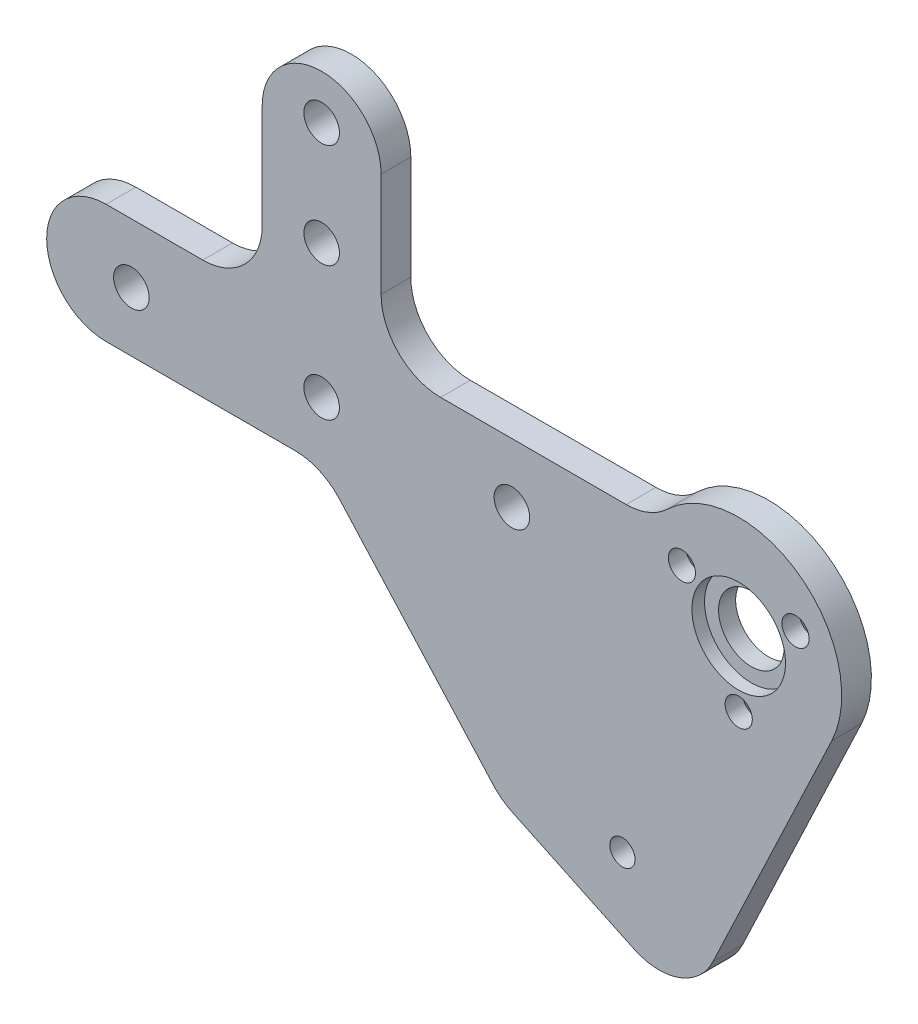
ISO-10303-21;
HEADER;
FILE_DESCRIPTION(('STEP AP214'),'2;1');
FILE_NAME('part.step','',(''),(''),'','','');
FILE_SCHEMA(('AUTOMOTIVE_DESIGN { 1 0 10303 214 1 1 1 1 }'));
ENDSEC;
DATA;
#1=APPLICATION_CONTEXT('core data for automotive mechanical design processes');
#2=APPLICATION_PROTOCOL_DEFINITION('international standard','automotive_design',2000,#1);
#3=PRODUCT_CONTEXT('',#1,'mechanical');
#4=PRODUCT('Part','Part','',(#3));
#5=PRODUCT_RELATED_PRODUCT_CATEGORY('part','',(#4));
#6=PRODUCT_DEFINITION_FORMATION('','',#4);
#7=PRODUCT_DEFINITION_CONTEXT('part definition',#1,'design');
#8=PRODUCT_DEFINITION('design','',#6,#7);
#9=PRODUCT_DEFINITION_SHAPE('','',#8);
#10=(LENGTH_UNIT() NAMED_UNIT(*) SI_UNIT(.MILLI.,.METRE.));
#11=(NAMED_UNIT(*) PLANE_ANGLE_UNIT() SI_UNIT($,.RADIAN.));
#12=(NAMED_UNIT(*) SI_UNIT($,.STERADIAN.) SOLID_ANGLE_UNIT());
#13=UNCERTAINTY_MEASURE_WITH_UNIT(LENGTH_MEASURE(1.E-05),#10,'distance_accuracy_value','');
#14=(GEOMETRIC_REPRESENTATION_CONTEXT(3) GLOBAL_UNCERTAINTY_ASSIGNED_CONTEXT((#13)) GLOBAL_UNIT_ASSIGNED_CONTEXT((#10,
#11,#12)) REPRESENTATION_CONTEXT('',''));
#15=CARTESIAN_POINT('',(0.,0.,0.));
#16=DIRECTION('',(0.,0.,1.));
#17=DIRECTION('',(1.,0.,0.));
#18=AXIS2_PLACEMENT_3D('',#15,#16,#17);
#19=CARTESIAN_POINT('',(0.,0.,0.));
#20=DIRECTION('',(0.,0.,1.));
#21=DIRECTION('',(1.,0.,0.));
#22=AXIS2_PLACEMENT_3D('',#19,#20,#21);
#23=PLANE('',#22);
#24=CARTESIAN_POINT('',(0.,119.190279828564,0.));
#25=DIRECTION('',(0.,0.,-1.));
#26=DIRECTION('',(-1.,0.,0.));
#27=AXIS2_PLACEMENT_3D('',#24,#25,#26);
#28=CIRCLE('',#27,1.89864999999999);
#29=CARTESIAN_POINT('',(-1.89864999999999,119.190279828564,0.));
#30=VERTEX_POINT('',#29);
#31=EDGE_CURVE('E410',#30,#30,#28,.T.);
#32=ORIENTED_EDGE('',*,*,#31,.F.);
#33=EDGE_LOOP('',(#32));
#34=FACE_BOUND('',#33,.T.);
#35=DIRECTION('',(1.,0.,0.));
#36=VECTOR('',#35,1.);
#37=CARTESIAN_POINT('',(0.,87.4402798285638,0.));
#38=LINE('',#37,#36);
#39=CARTESIAN_POINT('',(-23.01875,87.4402798285638,0.));
#40=VERTEX_POINT('',#39);
#41=CARTESIAN_POINT('',(-2.82498094697723,87.4402798285638,0.));
#42=VERTEX_POINT('',#41);
#43=EDGE_CURVE('E224',#40,#42,#38,.T.);
#44=ORIENTED_EDGE('',*,*,#43,.F.);
#45=CARTESIAN_POINT('',(-23.01875,93.7902798285638,0.));
#46=DIRECTION('',(0.,0.,1.));
#47=DIRECTION('',(1.,0.,0.));
#48=AXIS2_PLACEMENT_3D('',#45,#46,#47);
#49=CIRCLE('',#48,6.35);
#50=CARTESIAN_POINT('',(-29.36875,93.7902798285633,0.));
#51=VERTEX_POINT('',#50);
#52=EDGE_CURVE('E267',#40,#51,#49,.F.);
#53=ORIENTED_EDGE('',*,*,#52,.T.);
#54=CARTESIAN_POINT('',(-23.01875,93.7902798285633,0.));
#55=DIRECTION('',(0.,0.,1.));
#56=DIRECTION('',(1.,0.,0.));
#57=AXIS2_PLACEMENT_3D('',#54,#55,#56);
#58=CIRCLE('',#57,6.35);
#59=CARTESIAN_POINT('',(-23.0187500000001,100.140279828563,0.));
#60=VERTEX_POINT('',#59);
#61=EDGE_CURVE('E265',#51,#60,#58,.F.);
#62=ORIENTED_EDGE('',*,*,#61,.T.);
#63=DIRECTION('',(1.,0.,0.));
#64=VECTOR('',#63,1.);
#65=CARTESIAN_POINT('',(-9.16851453191598E-13,100.140279828563,0.));
#66=LINE('',#65,#64);
#67=CARTESIAN_POINT('',(-12.6999999999999,100.140279828563,0.));
#68=VERTEX_POINT('',#67);
#69=EDGE_CURVE('E221',#60,#68,#66,.T.);
#70=ORIENTED_EDGE('',*,*,#69,.T.);
#71=CARTESIAN_POINT('',(-12.7,106.490279828563,0.));
#72=DIRECTION('',(0.,0.,1.));
#73=DIRECTION('',(1.,0.,0.));
#74=AXIS2_PLACEMENT_3D('',#71,#72,#73);
#75=CIRCLE('',#74,6.35);
#76=CARTESIAN_POINT('',(-6.35,106.490279828563,0.));
#77=VERTEX_POINT('',#76);
#78=EDGE_CURVE('E300',#68,#77,#75,.T.);
#79=ORIENTED_EDGE('',*,*,#78,.T.);
#80=DIRECTION('',(0.,-1.,0.));
#81=VECTOR('',#80,1.);
#82=CARTESIAN_POINT('',(-6.34999999999998,0.,0.));
#83=LINE('',#82,#81);
#84=CARTESIAN_POINT('',(-6.35,117.602779828564,0.));
#85=VERTEX_POINT('',#84);
#86=EDGE_CURVE('E225',#85,#77,#83,.T.);
#87=ORIENTED_EDGE('',*,*,#86,.F.);
#88=CARTESIAN_POINT('',(0.,117.602779828564,0.));
#89=DIRECTION('',(0.,0.,1.));
#90=DIRECTION('',(1.,0.,0.));
#91=AXIS2_PLACEMENT_3D('',#88,#89,#90);
#92=CIRCLE('',#91,6.35);
#93=CARTESIAN_POINT('',(6.35,117.602779828564,0.));
#94=VERTEX_POINT('',#93);
#95=EDGE_CURVE('E229',#94,#85,#92,.T.);
#96=ORIENTED_EDGE('',*,*,#95,.F.);
#97=DIRECTION('',(0.,-1.,0.));
#98=VECTOR('',#97,1.);
#99=CARTESIAN_POINT('',(6.35000000000002,0.,0.));
#100=LINE('',#99,#98);
#101=CARTESIAN_POINT('',(6.35,106.490279828564,0.));
#102=VERTEX_POINT('',#101);
#103=EDGE_CURVE('E226',#94,#102,#100,.T.);
#104=ORIENTED_EDGE('',*,*,#103,.T.);
#105=CARTESIAN_POINT('',(12.7,106.490279828564,0.));
#106=DIRECTION('',(0.,0.,1.));
#107=DIRECTION('',(1.,0.,0.));
#108=AXIS2_PLACEMENT_3D('',#105,#106,#107);
#109=CIRCLE('',#108,6.35);
#110=CARTESIAN_POINT('',(12.7000000000001,100.140279828564,0.));
#111=VERTEX_POINT('',#110);
#112=EDGE_CURVE('E45',#102,#111,#109,.T.);
#113=ORIENTED_EDGE('',*,*,#112,.T.);
#114=CARTESIAN_POINT('',(32.5242913171157,100.140279828564,0.));
#115=VERTEX_POINT('',#114);
#116=EDGE_CURVE('E220',#111,#115,#66,.T.);
#117=ORIENTED_EDGE('',*,*,#116,.T.);
#118=CARTESIAN_POINT('',(32.5242913171156,106.490279828564,0.));
#119=DIRECTION('',(0.,0.,1.));
#120=DIRECTION('',(1.,0.,0.));
#121=AXIS2_PLACEMENT_3D('',#118,#119,#120);
#122=CIRCLE('',#121,6.35);
#123=CARTESIAN_POINT('',(36.9233094126202,101.910854122711,0.));
#124=VERTEX_POINT('',#123);
#125=EDGE_CURVE('E292',#115,#124,#122,.T.);
#126=ORIENTED_EDGE('',*,*,#125,.T.);
#127=CARTESIAN_POINT('',(44.5436557197935,93.9779906952501,0.));
#128=DIRECTION('',(0.,0.,1.));
#129=DIRECTION('',(1.,0.,0.));
#130=AXIS2_PLACEMENT_3D('',#127,#128,#129);
#131=CIRCLE('',#130,11.);
#132=CARTESIAN_POINT('',(54.483635504868,89.2666424941181,0.));
#133=VERTEX_POINT('',#132);
#134=EDGE_CURVE('E218',#133,#124,#131,.T.);
#135=ORIENTED_EDGE('',*,*,#134,.F.);
#136=DIRECTION('',(-0.428304381921091,-0.903634525915866,0.));
#137=VECTOR('',#136,1.);
#138=CARTESIAN_POINT('',(9.93997978507457,-4.71134820113202,0.));
#139=LINE('',#138,#137);
#140=CARTESIAN_POINT('',(41.7844105809077,62.4738788007127,0.));
#141=VERTEX_POINT('',#140);
#142=EDGE_CURVE('E170',#133,#141,#139,.T.);
#143=ORIENTED_EDGE('',*,*,#142,.T.);
#144=CARTESIAN_POINT('',(36.0463313413419,65.1936116259116,0.));
#145=DIRECTION('',(0.,0.,1.));
#146=DIRECTION('',(1.,0.,0.));
#147=AXIS2_PLACEMENT_3D('',#144,#145,#146);
#148=CIRCLE('',#147,6.35);
#149=CARTESIAN_POINT('',(33.326598516143,59.4555323863458,0.));
#150=VERTEX_POINT('',#149);
#151=EDGE_CURVE('E263',#141,#150,#148,.F.);
#152=ORIENTED_EDGE('',*,*,#151,.T.);
#153=DIRECTION('',(-0.903634525915866,0.42830438192109,0.));
#154=VECTOR('',#153,1.);
#155=CARTESIAN_POINT('',(29.1246979706341,61.4471477622789,0.));
#156=LINE('',#155,#154);
#157=CARTESIAN_POINT('',(20.3316402914357,65.6148782179833,0.));
#158=VERTEX_POINT('',#157);
#159=EDGE_CURVE('E213',#150,#158,#156,.T.);
#160=ORIENTED_EDGE('',*,*,#159,.T.);
#161=CARTESIAN_POINT('',(23.0513731166347,71.3529574575491,0.));
#162=DIRECTION('',(0.,0.,1.));
#163=DIRECTION('',(1.,0.,0.));
#164=AXIS2_PLACEMENT_3D('',#161,#162,#163);
#165=CIRCLE('',#164,6.35);
#166=CARTESIAN_POINT('',(18.3348853905262,67.1012232784795,0.));
#167=VERTEX_POINT('',#166);
#168=EDGE_CURVE('E261',#158,#167,#165,.F.);
#169=ORIENTED_EDGE('',*,*,#168,.T.);
#170=DIRECTION('',(-0.66956443764875,0.742753972615504,0.));
#171=VECTOR('',#170,1.);
#172=CARTESIAN_POINT('',(43.4859438897894,39.2009233739427,0.));
#173=LINE('',#172,#171);
#174=CARTESIAN_POINT('',(1.89150677913122,85.3420140076334,0.));
#175=VERTEX_POINT('',#174);
#176=EDGE_CURVE('E210',#167,#175,#173,.T.);
#177=ORIENTED_EDGE('',*,*,#176,.T.);
#178=CARTESIAN_POINT('',(-2.82498094697723,81.0902798285638,0.));
#179=DIRECTION('',(0.,0.,1.));
#180=DIRECTION('',(1.,0.,0.));
#181=AXIS2_PLACEMENT_3D('',#178,#179,#180);
#182=CIRCLE('',#181,6.35);
#183=EDGE_CURVE('E296',#175,#42,#182,.T.);
#184=ORIENTED_EDGE('',*,*,#183,.T.);
#185=EDGE_LOOP('',(#44,#53,#62,#70,#79,#87,#96,#104,#113,#117,#126,#135,#143,#152,#160,#169,
#177,#184));
#186=FACE_BOUND('',#185,.T.);
#187=CARTESIAN_POINT('',(44.5436557197935,93.9779906952501,0.));
#188=DIRECTION('',(0.,0.,1.));
#189=DIRECTION('',(1.,0.,0.));
#190=AXIS2_PLACEMENT_3D('',#187,#188,#189);
#191=CIRCLE('',#190,3.5);
#192=CARTESIAN_POINT('',(48.0436557197935,93.9779906952501,0.));
#193=VERTEX_POINT('',#192);
#194=EDGE_CURVE('E235',#193,#193,#191,.T.);
#195=ORIENTED_EDGE('',*,*,#194,.T.);
#196=EDGE_LOOP('',(#195));
#197=FACE_BOUND('',#196,.T.);
#198=CARTESIAN_POINT('',(0.,108.077779828564,0.));
#199=DIRECTION('',(0.,0.,-1.));
#200=DIRECTION('',(-1.,0.,0.));
#201=AXIS2_PLACEMENT_3D('',#198,#199,#200);
#202=CIRCLE('',#201,1.89864999999999);
#203=CARTESIAN_POINT('',(-1.89864999999999,108.077779828564,0.));
#204=VERTEX_POINT('',#203);
#205=EDGE_CURVE('E404',#204,#204,#202,.T.);
#206=ORIENTED_EDGE('',*,*,#205,.F.);
#207=EDGE_LOOP('',(#206));
#208=FACE_BOUND('',#207,.T.);
#209=CARTESIAN_POINT('',(38.4814778933024,97.4779906952501,0.));
#210=DIRECTION('',(0.,0.,-1.));
#211=DIRECTION('',(-1.,0.,0.));
#212=AXIS2_PLACEMENT_3D('',#209,#210,#211);
#213=CIRCLE('',#212,2.75);
#214=CARTESIAN_POINT('',(35.7314778933024,97.4779906952501,0.));
#215=VERTEX_POINT('',#214);
#216=EDGE_CURVE('E395',#215,#215,#213,.T.);
#217=ORIENTED_EDGE('',*,*,#216,.F.);
#218=EDGE_LOOP('',(#217));
#219=FACE_BOUND('',#218,.T.);
#220=CARTESIAN_POINT('',(44.5436557197935,86.9779906952501,0.));
#221=DIRECTION('',(0.,0.,-1.));
#222=DIRECTION('',(-1.,0.,0.));
#223=AXIS2_PLACEMENT_3D('',#220,#221,#222);
#224=CIRCLE('',#223,2.75);
#225=CARTESIAN_POINT('',(41.7936557197935,86.9779906952501,0.));
#226=VERTEX_POINT('',#225);
#227=EDGE_CURVE('E386',#226,#226,#224,.T.);
#228=ORIENTED_EDGE('',*,*,#227,.F.);
#229=EDGE_LOOP('',(#228));
#230=FACE_BOUND('',#229,.T.);
#231=CARTESIAN_POINT('',(50.6058335462846,97.4779906952501,0.));
#232=DIRECTION('',(0.,0.,-1.));
#233=DIRECTION('',(-1.,0.,0.));
#234=AXIS2_PLACEMENT_3D('',#231,#232,#233);
#235=CIRCLE('',#234,2.75);
#236=CARTESIAN_POINT('',(47.8558335462846,97.4779906952501,0.));
#237=VERTEX_POINT('',#236);
#238=EDGE_CURVE('E244',#237,#237,#235,.T.);
#239=ORIENTED_EDGE('',*,*,#238,.F.);
#240=EDGE_LOOP('',(#239));
#241=FACE_BOUND('',#240,.T.);
#242=CARTESIAN_POINT('',(20.32,93.7902798285639,0.));
#243=DIRECTION('',(0.,0.,-1.));
#244=DIRECTION('',(-1.,0.,0.));
#245=AXIS2_PLACEMENT_3D('',#242,#243,#244);
#246=CIRCLE('',#245,1.89865);
#247=CARTESIAN_POINT('',(18.42135,93.7902798285639,0.));
#248=VERTEX_POINT('',#247);
#249=EDGE_CURVE('E245',#248,#248,#246,.T.);
#250=ORIENTED_EDGE('',*,*,#249,.F.);
#251=EDGE_LOOP('',(#250));
#252=FACE_BOUND('',#251,.T.);
#253=CARTESIAN_POINT('',(0.,93.7902798285639,0.));
#254=DIRECTION('',(0.,0.,-1.));
#255=DIRECTION('',(-1.,0.,0.));
#256=AXIS2_PLACEMENT_3D('',#253,#254,#255);
#257=CIRCLE('',#256,1.89865);
#258=CARTESIAN_POINT('',(-1.89865,93.7902798285639,0.));
#259=VERTEX_POINT('',#258);
#260=EDGE_CURVE('E370',#259,#259,#257,.T.);
#261=ORIENTED_EDGE('',*,*,#260,.F.);
#262=EDGE_LOOP('',(#261));
#263=FACE_BOUND('',#262,.T.);
#264=CARTESIAN_POINT('',(-20.32,93.7902798285639,0.));
#265=DIRECTION('',(0.,0.,-1.));
#266=DIRECTION('',(-1.,0.,0.));
#267=AXIS2_PLACEMENT_3D('',#264,#265,#266);
#268=CIRCLE('',#267,1.89865);
#269=CARTESIAN_POINT('',(-22.21865,93.7902798285639,0.));
#270=VERTEX_POINT('',#269);
#271=EDGE_CURVE('E359',#270,#270,#268,.T.);
#272=ORIENTED_EDGE('',*,*,#271,.F.);
#273=EDGE_LOOP('',(#272));
#274=FACE_BOUND('',#273,.T.);
#275=CARTESIAN_POINT('',(32.1228286440819,67.7725894436899,0.));
#276=DIRECTION('',(0.,0.,-1.));
#277=DIRECTION('',(-1.,0.,0.));
#278=AXIS2_PLACEMENT_3D('',#275,#276,#277);
#279=CIRCLE('',#278,1.35254999999999);
#280=CARTESIAN_POINT('',(30.7702786440819,67.7725894436899,0.));
#281=VERTEX_POINT('',#280);
#282=EDGE_CURVE('E346',#281,#281,#279,.T.);
#283=ORIENTED_EDGE('',*,*,#282,.F.);
#284=EDGE_LOOP('',(#283));
#285=FACE_BOUND('',#284,.T.);
#286=ADVANCED_FACE('F36',(#34,#186,#197,#208,#219,#230,#241,#252,#263,#274,#285),#23,.F.);
#287=CARTESIAN_POINT('',(44.5436557197935,93.9779906952501,3.175));
#288=DIRECTION('',(0.,0.,-1.));
#289=DIRECTION('',(-1.,0.,0.));
#290=AXIS2_PLACEMENT_3D('',#287,#288,#289);
#291=CYLINDRICAL_SURFACE('',#290,3.5);
#292=ORIENTED_EDGE('',*,*,#194,.F.);
#293=EDGE_LOOP('',(#292));
#294=FACE_BOUND('',#293,.T.);
#295=CARTESIAN_POINT('',(44.5436557197935,93.9779906952501,1.82626));
#296=DIRECTION('',(0.,0.,1.));
#297=DIRECTION('',(1.,0.,0.));
#298=AXIS2_PLACEMENT_3D('',#295,#296,#297);
#299=CIRCLE('',#298,3.5);
#300=CARTESIAN_POINT('',(48.0436557197935,93.9779906952501,1.82626));
#301=VERTEX_POINT('',#300);
#302=EDGE_CURVE('E353',#301,#301,#299,.T.);
#303=ORIENTED_EDGE('',*,*,#302,.T.);
#304=EDGE_LOOP('',(#303));
#305=FACE_BOUND('',#304,.T.);
#306=ADVANCED_FACE('F443',(#294,#305),#291,.F.);
#307=CARTESIAN_POINT('',(0.,0.,3.175));
#308=DIRECTION('',(0.,0.,1.));
#309=DIRECTION('',(1.,0.,0.));
#310=AXIS2_PLACEMENT_3D('',#307,#308,#309);
#311=PLANE('',#310);
#312=CARTESIAN_POINT('',(32.1228286440819,67.7725894436899,3.175));
#313=DIRECTION('',(0.,0.,1.));
#314=DIRECTION('',(1.,0.,0.));
#315=AXIS2_PLACEMENT_3D('',#312,#313,#314);
#316=CIRCLE('',#315,1.35254999999997);
#317=CARTESIAN_POINT('',(33.4753786440818,67.7725894436899,3.175));
#318=VERTEX_POINT('',#317);
#319=EDGE_CURVE('E348',#318,#318,#316,.T.);
#320=ORIENTED_EDGE('',*,*,#319,.F.);
#321=EDGE_LOOP('',(#320));
#322=FACE_BOUND('',#321,.T.);
#323=CARTESIAN_POINT('',(-23.01875,93.7902798285633,3.175));
#324=DIRECTION('',(0.,0.,1.));
#325=DIRECTION('',(1.,0.,0.));
#326=AXIS2_PLACEMENT_3D('',#323,#324,#325);
#327=CIRCLE('',#326,6.35);
#328=CARTESIAN_POINT('',(-23.0187500000001,100.140279828563,3.175));
#329=VERTEX_POINT('',#328);
#330=CARTESIAN_POINT('',(-29.36875,93.7902798285633,3.175));
#331=VERTEX_POINT('',#330);
#332=EDGE_CURVE('E52',#329,#331,#327,.T.);
#333=ORIENTED_EDGE('',*,*,#332,.T.);
#334=CARTESIAN_POINT('',(-23.01875,93.7902798285638,3.175));
#335=DIRECTION('',(0.,0.,1.));
#336=DIRECTION('',(1.,0.,0.));
#337=AXIS2_PLACEMENT_3D('',#334,#335,#336);
#338=CIRCLE('',#337,6.35);
#339=CARTESIAN_POINT('',(-23.01875,87.4402798285638,3.175));
#340=VERTEX_POINT('',#339);
#341=EDGE_CURVE('E273',#331,#340,#338,.T.);
#342=ORIENTED_EDGE('',*,*,#341,.T.);
#343=DIRECTION('',(1.,0.,0.));
#344=VECTOR('',#343,1.);
#345=CARTESIAN_POINT('',(0.,87.4402798285638,3.175));
#346=LINE('',#345,#344);
#347=CARTESIAN_POINT('',(-2.82498094697723,87.4402798285638,3.175));
#348=VERTEX_POINT('',#347);
#349=EDGE_CURVE('E199',#340,#348,#346,.T.);
#350=ORIENTED_EDGE('',*,*,#349,.T.);
#351=CARTESIAN_POINT('',(-2.82498094697723,81.0902798285638,3.175));
#352=DIRECTION('',(0.,0.,1.));
#353=DIRECTION('',(1.,0.,0.));
#354=AXIS2_PLACEMENT_3D('',#351,#352,#353);
#355=CIRCLE('',#354,6.35);
#356=CARTESIAN_POINT('',(1.89150677913122,85.3420140076334,3.175));
#357=VERTEX_POINT('',#356);
#358=EDGE_CURVE('E298',#348,#357,#355,.F.);
#359=ORIENTED_EDGE('',*,*,#358,.T.);
#360=DIRECTION('',(-0.66956443764875,0.742753972615504,0.));
#361=VECTOR('',#360,1.);
#362=CARTESIAN_POINT('',(43.4859438897894,39.2009233739427,3.175));
#363=LINE('',#362,#361);
#364=CARTESIAN_POINT('',(18.3348853905262,67.1012232784795,3.175));
#365=VERTEX_POINT('',#364);
#366=EDGE_CURVE('E193',#365,#357,#363,.T.);
#367=ORIENTED_EDGE('',*,*,#366,.F.);
#368=CARTESIAN_POINT('',(23.0513731166347,71.3529574575491,3.175));
#369=DIRECTION('',(0.,0.,1.));
#370=DIRECTION('',(1.,0.,0.));
#371=AXIS2_PLACEMENT_3D('',#368,#369,#370);
#372=CIRCLE('',#371,6.35);
#373=CARTESIAN_POINT('',(20.3316402914357,65.6148782179833,3.175));
#374=VERTEX_POINT('',#373);
#375=EDGE_CURVE('E269',#365,#374,#372,.T.);
#376=ORIENTED_EDGE('',*,*,#375,.T.);
#377=DIRECTION('',(-0.903634525915866,0.42830438192109,0.));
#378=VECTOR('',#377,1.);
#379=CARTESIAN_POINT('',(29.1246979706341,61.4471477622789,3.175));
#380=LINE('',#379,#378);
#381=CARTESIAN_POINT('',(33.326598516143,59.4555323863458,3.175));
#382=VERTEX_POINT('',#381);
#383=EDGE_CURVE('E190',#382,#374,#380,.T.);
#384=ORIENTED_EDGE('',*,*,#383,.F.);
#385=CARTESIAN_POINT('',(36.0463313413419,65.1936116259116,3.175));
#386=DIRECTION('',(0.,0.,1.));
#387=DIRECTION('',(1.,0.,0.));
#388=AXIS2_PLACEMENT_3D('',#385,#386,#387);
#389=CIRCLE('',#388,6.35);
#390=CARTESIAN_POINT('',(41.7844105809077,62.4738788007127,3.175));
#391=VERTEX_POINT('',#390);
#392=EDGE_CURVE('E189',#382,#391,#389,.T.);
#393=ORIENTED_EDGE('',*,*,#392,.T.);
#394=DIRECTION('',(-0.428304381921091,-0.903634525915866,0.));
#395=VECTOR('',#394,1.);
#396=CARTESIAN_POINT('',(9.93997978507457,-4.71134820113202,3.175));
#397=LINE('',#396,#395);
#398=CARTESIAN_POINT('',(54.483635504868,89.2666424941181,3.175));
#399=VERTEX_POINT('',#398);
#400=EDGE_CURVE('E167',#399,#391,#397,.T.);
#401=ORIENTED_EDGE('',*,*,#400,.F.);
#402=CARTESIAN_POINT('',(44.5436557197935,93.9779906952501,3.175));
#403=DIRECTION('',(0.,0.,1.));
#404=DIRECTION('',(1.,0.,0.));
#405=AXIS2_PLACEMENT_3D('',#402,#403,#404);
#406=CIRCLE('',#405,11.);
#407=CARTESIAN_POINT('',(36.9233094126202,101.910854122711,3.175));
#408=VERTEX_POINT('',#407);
#409=EDGE_CURVE('E178',#399,#408,#406,.T.);
#410=ORIENTED_EDGE('',*,*,#409,.T.);
#411=CARTESIAN_POINT('',(32.5242913171156,106.490279828564,3.175));
#412=DIRECTION('',(0.,0.,1.));
#413=DIRECTION('',(1.,0.,0.));
#414=AXIS2_PLACEMENT_3D('',#411,#412,#413);
#415=CIRCLE('',#414,6.35);
#416=CARTESIAN_POINT('',(32.5242913171157,100.140279828564,3.175));
#417=VERTEX_POINT('',#416);
#418=EDGE_CURVE('E294',#408,#417,#415,.F.);
#419=ORIENTED_EDGE('',*,*,#418,.T.);
#420=DIRECTION('',(1.,0.,0.));
#421=VECTOR('',#420,1.);
#422=CARTESIAN_POINT('',(-9.16851453191598E-13,100.140279828563,3.175));
#423=LINE('',#422,#421);
#424=CARTESIAN_POINT('',(12.7000000000001,100.140279828564,3.175));
#425=VERTEX_POINT('',#424);
#426=EDGE_CURVE('E183',#425,#417,#423,.T.);
#427=ORIENTED_EDGE('',*,*,#426,.F.);
#428=CARTESIAN_POINT('',(12.7,106.490279828564,3.175));
#429=DIRECTION('',(0.,0.,1.));
#430=DIRECTION('',(1.,0.,0.));
#431=AXIS2_PLACEMENT_3D('',#428,#429,#430);
#432=CIRCLE('',#431,6.35);
#433=CARTESIAN_POINT('',(6.35,106.490279828564,3.175));
#434=VERTEX_POINT('',#433);
#435=EDGE_CURVE('E11',#425,#434,#432,.F.);
#436=ORIENTED_EDGE('',*,*,#435,.T.);
#437=DIRECTION('',(0.,-1.,0.));
#438=VECTOR('',#437,1.);
#439=CARTESIAN_POINT('',(6.35000000000002,0.,3.175));
#440=LINE('',#439,#438);
#441=CARTESIAN_POINT('',(6.35,117.602779828564,3.175));
#442=VERTEX_POINT('',#441);
#443=EDGE_CURVE('E201',#442,#434,#440,.T.);
#444=ORIENTED_EDGE('',*,*,#443,.F.);
#445=CARTESIAN_POINT('',(0.,117.602779828564,3.175));
#446=DIRECTION('',(0.,0.,1.));
#447=DIRECTION('',(1.,0.,0.));
#448=AXIS2_PLACEMENT_3D('',#445,#446,#447);
#449=CIRCLE('',#448,6.35);
#450=CARTESIAN_POINT('',(-6.35,117.602779828564,3.175));
#451=VERTEX_POINT('',#450);
#452=EDGE_CURVE('E204',#442,#451,#449,.T.);
#453=ORIENTED_EDGE('',*,*,#452,.T.);
#454=DIRECTION('',(0.,-1.,0.));
#455=VECTOR('',#454,1.);
#456=CARTESIAN_POINT('',(-6.34999999999998,0.,3.175));
#457=LINE('',#456,#455);
#458=CARTESIAN_POINT('',(-6.35,106.490279828563,3.175));
#459=VERTEX_POINT('',#458);
#460=EDGE_CURVE('E200',#451,#459,#457,.T.);
#461=ORIENTED_EDGE('',*,*,#460,.T.);
#462=CARTESIAN_POINT('',(-12.7,106.490279828563,3.175));
#463=DIRECTION('',(0.,0.,1.));
#464=DIRECTION('',(1.,0.,0.));
#465=AXIS2_PLACEMENT_3D('',#462,#463,#464);
#466=CIRCLE('',#465,6.35);
#467=CARTESIAN_POINT('',(-12.6999999999999,100.140279828563,3.175));
#468=VERTEX_POINT('',#467);
#469=EDGE_CURVE('E58',#459,#468,#466,.F.);
#470=ORIENTED_EDGE('',*,*,#469,.T.);
#471=EDGE_CURVE('E197',#329,#468,#423,.T.);
#472=ORIENTED_EDGE('',*,*,#471,.F.);
#473=EDGE_LOOP('',(#333,#342,#350,#359,#367,#376,#384,#393,#401,#410,#419,#427,#436,#444,#453,
#461,#470,#472));
#474=FACE_BOUND('',#473,.T.);
#475=CARTESIAN_POINT('',(0.,119.190279828564,3.175));
#476=DIRECTION('',(0.,0.,1.));
#477=DIRECTION('',(1.,0.,0.));
#478=AXIS2_PLACEMENT_3D('',#475,#476,#477);
#479=CIRCLE('',#478,1.89864999999999);
#480=CARTESIAN_POINT('',(1.89864999999999,119.190279828564,3.175));
#481=VERTEX_POINT('',#480);
#482=EDGE_CURVE('E214',#481,#481,#479,.T.);
#483=ORIENTED_EDGE('',*,*,#482,.F.);
#484=EDGE_LOOP('',(#483));
#485=FACE_BOUND('',#484,.T.);
#486=CARTESIAN_POINT('',(0.,108.077779828564,3.175));
#487=DIRECTION('',(0.,0.,1.));
#488=DIRECTION('',(1.,0.,0.));
#489=AXIS2_PLACEMENT_3D('',#486,#487,#488);
#490=CIRCLE('',#489,1.89864999999999);
#491=CARTESIAN_POINT('',(1.89864999999999,108.077779828564,3.175));
#492=VERTEX_POINT('',#491);
#493=EDGE_CURVE('E407',#492,#492,#490,.T.);
#494=ORIENTED_EDGE('',*,*,#493,.F.);
#495=EDGE_LOOP('',(#494));
#496=FACE_BOUND('',#495,.T.);
#497=CARTESIAN_POINT('',(38.4814778933024,97.4779906952501,3.175));
#498=DIRECTION('',(0.,0.,-1.));
#499=DIRECTION('',(-1.,0.,0.));
#500=AXIS2_PLACEMENT_3D('',#497,#498,#499);
#501=CIRCLE('',#500,1.45);
#502=CARTESIAN_POINT('',(37.0314778933024,97.4779906952501,3.175));
#503=VERTEX_POINT('',#502);
#504=EDGE_CURVE('E401',#503,#503,#501,.T.);
#505=ORIENTED_EDGE('',*,*,#504,.T.);
#506=EDGE_LOOP('',(#505));
#507=FACE_BOUND('',#506,.T.);
#508=CARTESIAN_POINT('',(44.5436557197935,86.9779906952501,3.175));
#509=DIRECTION('',(0.,0.,-1.));
#510=DIRECTION('',(-1.,0.,0.));
#511=AXIS2_PLACEMENT_3D('',#508,#509,#510);
#512=CIRCLE('',#511,1.45);
#513=CARTESIAN_POINT('',(43.0936557197935,86.9779906952501,3.175));
#514=VERTEX_POINT('',#513);
#515=EDGE_CURVE('E392',#514,#514,#512,.T.);
#516=ORIENTED_EDGE('',*,*,#515,.T.);
#517=EDGE_LOOP('',(#516));
#518=FACE_BOUND('',#517,.T.);
#519=CARTESIAN_POINT('',(50.6058335462846,97.4779906952501,3.175));
#520=DIRECTION('',(0.,0.,-1.));
#521=DIRECTION('',(-1.,0.,0.));
#522=AXIS2_PLACEMENT_3D('',#519,#520,#521);
#523=CIRCLE('',#522,1.45);
#524=CARTESIAN_POINT('',(49.1558335462846,97.4779906952501,3.175));
#525=VERTEX_POINT('',#524);
#526=EDGE_CURVE('E383',#525,#525,#523,.T.);
#527=ORIENTED_EDGE('',*,*,#526,.T.);
#528=EDGE_LOOP('',(#527));
#529=FACE_BOUND('',#528,.T.);
#530=CARTESIAN_POINT('',(20.32,93.7902798285639,3.175));
#531=DIRECTION('',(0.,0.,1.));
#532=DIRECTION('',(1.,0.,0.));
#533=AXIS2_PLACEMENT_3D('',#530,#531,#532);
#534=CIRCLE('',#533,1.89865);
#535=CARTESIAN_POINT('',(22.21865,93.7902798285639,3.175));
#536=VERTEX_POINT('',#535);
#537=EDGE_CURVE('E241',#536,#536,#534,.T.);
#538=ORIENTED_EDGE('',*,*,#537,.F.);
#539=EDGE_LOOP('',(#538));
#540=FACE_BOUND('',#539,.T.);
#541=CARTESIAN_POINT('',(0.,93.7902798285639,3.175));
#542=DIRECTION('',(0.,0.,1.));
#543=DIRECTION('',(1.,0.,0.));
#544=AXIS2_PLACEMENT_3D('',#541,#542,#543);
#545=CIRCLE('',#544,1.89865);
#546=CARTESIAN_POINT('',(1.89864999999999,93.7902798285639,3.175));
#547=VERTEX_POINT('',#546);
#548=EDGE_CURVE('E373',#547,#547,#545,.T.);
#549=ORIENTED_EDGE('',*,*,#548,.F.);
#550=EDGE_LOOP('',(#549));
#551=FACE_BOUND('',#550,.T.);
#552=CARTESIAN_POINT('',(-20.32,93.7902798285639,3.175));
#553=DIRECTION('',(0.,0.,1.));
#554=DIRECTION('',(1.,0.,0.));
#555=AXIS2_PLACEMENT_3D('',#552,#553,#554);
#556=CIRCLE('',#555,1.89865);
#557=CARTESIAN_POINT('',(-18.42135,93.7902798285639,3.175));
#558=VERTEX_POINT('',#557);
#559=EDGE_CURVE('E367',#558,#558,#556,.T.);
#560=ORIENTED_EDGE('',*,*,#559,.F.);
#561=EDGE_LOOP('',(#560));
#562=FACE_BOUND('',#561,.T.);
#563=CARTESIAN_POINT('',(44.5436557197935,93.9779906952501,3.175));
#564=DIRECTION('',(0.,0.,1.));
#565=DIRECTION('',(1.,0.,0.));
#566=AXIS2_PLACEMENT_3D('',#563,#564,#565);
#567=CIRCLE('',#566,5.);
#568=CARTESIAN_POINT('',(49.5436557197935,93.9779906952501,3.175));
#569=VERTEX_POINT('',#568);
#570=EDGE_CURVE('E356',#569,#569,#567,.T.);
#571=ORIENTED_EDGE('',*,*,#570,.F.);
#572=EDGE_LOOP('',(#571));
#573=FACE_BOUND('',#572,.T.);
#574=ADVANCED_FACE('F185',(#322,#474,#485,#496,#507,#518,#529,#540,#551,#562,#573),#311,.T.);
#575=CARTESIAN_POINT('',(43.4859438897894,39.2009233739427,3.175));
#576=DIRECTION('',(-0.742753972615504,-0.66956443764875,0.));
#577=DIRECTION('',(0.66956443764875,-0.742753972615504,0.));
#578=AXIS2_PLACEMENT_3D('',#575,#576,#577);
#579=PLANE('',#578);
#580=ORIENTED_EDGE('',*,*,#366,.T.);
#581=DIRECTION('',(0.,0.,-1.));
#582=VECTOR('',#581,1.);
#583=CARTESIAN_POINT('',(1.89150677913122,85.3420140076334,3.175));
#584=LINE('',#583,#582);
#585=EDGE_CURVE('E253',#357,#175,#584,.T.);
#586=ORIENTED_EDGE('',*,*,#585,.T.);
#587=ORIENTED_EDGE('',*,*,#176,.F.);
#588=DIRECTION('',(0.,0.,-1.));
#589=VECTOR('',#588,1.);
#590=CARTESIAN_POINT('',(18.3348853905262,67.1012232784795,3.175));
#591=LINE('',#590,#589);
#592=EDGE_CURVE('E251',#167,#365,#591,.F.);
#593=ORIENTED_EDGE('',*,*,#592,.T.);
#594=EDGE_LOOP('',(#580,#586,#587,#593));
#595=FACE_BOUND('',#594,.T.);
#596=ADVANCED_FACE('F418',(#595),#579,.T.);
#597=CARTESIAN_POINT('',(29.1246979706341,61.4471477622789,3.175));
#598=DIRECTION('',(-0.42830438192109,-0.903634525915866,0.));
#599=DIRECTION('',(0.903634525915866,-0.42830438192109,0.));
#600=AXIS2_PLACEMENT_3D('',#597,#598,#599);
#601=PLANE('',#600);
#602=ORIENTED_EDGE('',*,*,#159,.F.);
#603=DIRECTION('',(0.,0.,-1.));
#604=VECTOR('',#603,1.);
#605=CARTESIAN_POINT('',(33.326598516143,59.4555323863458,3.175));
#606=LINE('',#605,#604);
#607=EDGE_CURVE('E290',#150,#382,#606,.F.);
#608=ORIENTED_EDGE('',*,*,#607,.T.);
#609=ORIENTED_EDGE('',*,*,#383,.T.);
#610=DIRECTION('',(0.,0.,-1.));
#611=VECTOR('',#610,1.);
#612=CARTESIAN_POINT('',(20.3316402914357,65.6148782179833,3.175));
#613=LINE('',#612,#611);
#614=EDGE_CURVE('E287',#374,#158,#613,.T.);
#615=ORIENTED_EDGE('',*,*,#614,.T.);
#616=EDGE_LOOP('',(#602,#608,#609,#615));
#617=FACE_BOUND('',#616,.T.);
#618=ADVANCED_FACE('F536',(#617),#601,.T.);
#619=CARTESIAN_POINT('',(9.93997978507457,-4.71134820113202,3.175));
#620=DIRECTION('',(0.903634525915866,-0.428304381921091,0.));
#621=DIRECTION('',(0.428304381921091,0.903634525915866,0.));
#622=AXIS2_PLACEMENT_3D('',#619,#620,#621);
#623=PLANE('',#622);
#624=ORIENTED_EDGE('',*,*,#400,.T.);
#625=DIRECTION('',(0.,0.,-1.));
#626=VECTOR('',#625,1.);
#627=CARTESIAN_POINT('',(41.7844105809077,62.4738788007126,3.175));
#628=LINE('',#627,#626);
#629=EDGE_CURVE('E285',#391,#141,#628,.T.);
#630=ORIENTED_EDGE('',*,*,#629,.T.);
#631=ORIENTED_EDGE('',*,*,#142,.F.);
#632=DIRECTION('',(0.,0.,-1.));
#633=VECTOR('',#632,1.);
#634=CARTESIAN_POINT('',(54.483635504868,89.2666424941181,3.175));
#635=LINE('',#634,#633);
#636=EDGE_CURVE('E162',#399,#133,#635,.T.);
#637=ORIENTED_EDGE('',*,*,#636,.F.);
#638=EDGE_LOOP('',(#624,#630,#631,#637));
#639=FACE_BOUND('',#638,.T.);
#640=ADVANCED_FACE('F164',(#639),#623,.T.);
#641=CARTESIAN_POINT('',(44.5436557197935,93.9779906952501,3.175));
#642=DIRECTION('',(0.,0.,-1.));
#643=DIRECTION('',(-1.,0.,0.));
#644=AXIS2_PLACEMENT_3D('',#641,#642,#643);
#645=CYLINDRICAL_SURFACE('',#644,11.);
#646=ORIENTED_EDGE('',*,*,#134,.T.);
#647=DIRECTION('',(0.,0.,-1.));
#648=VECTOR('',#647,1.);
#649=CARTESIAN_POINT('',(36.9233094126202,101.910854122711,3.175));
#650=LINE('',#649,#648);
#651=EDGE_CURVE('E181',#124,#408,#650,.F.);
#652=ORIENTED_EDGE('',*,*,#651,.T.);
#653=ORIENTED_EDGE('',*,*,#409,.F.);
#654=ORIENTED_EDGE('',*,*,#636,.T.);
#655=EDGE_LOOP('',(#646,#652,#653,#654));
#656=FACE_BOUND('',#655,.T.);
#657=ADVANCED_FACE('F179',(#656),#645,.T.);
#658=CARTESIAN_POINT('',(-9.16851453191598E-13,100.140279828563,3.175));
#659=DIRECTION('',(0.,1.,0.));
#660=DIRECTION('',(-1.,0.,0.));
#661=AXIS2_PLACEMENT_3D('',#658,#659,#660);
#662=PLANE('',#661);
#663=ORIENTED_EDGE('',*,*,#426,.T.);
#664=DIRECTION('',(0.,0.,-1.));
#665=VECTOR('',#664,1.);
#666=CARTESIAN_POINT('',(32.5242913171157,100.140279828564,3.175));
#667=LINE('',#666,#665);
#668=EDGE_CURVE('E247',#417,#115,#667,.T.);
#669=ORIENTED_EDGE('',*,*,#668,.T.);
#670=ORIENTED_EDGE('',*,*,#116,.F.);
#671=DIRECTION('',(0.,0.,-1.));
#672=VECTOR('',#671,1.);
#673=CARTESIAN_POINT('',(12.7000000000001,100.140279828564,3.175));
#674=LINE('',#673,#672);
#675=EDGE_CURVE('E174',#111,#425,#674,.F.);
#676=ORIENTED_EDGE('',*,*,#675,.T.);
#677=EDGE_LOOP('',(#663,#669,#670,#676));
#678=FACE_BOUND('',#677,.T.);
#679=ADVANCED_FACE('F315',(#678),#662,.T.);
#680=CARTESIAN_POINT('',(6.35000000000002,0.,3.175));
#681=DIRECTION('',(1.,0.,0.));
#682=DIRECTION('',(0.,1.,0.));
#683=AXIS2_PLACEMENT_3D('',#680,#681,#682);
#684=PLANE('',#683);
#685=ORIENTED_EDGE('',*,*,#443,.T.);
#686=DIRECTION('',(0.,0.,-1.));
#687=VECTOR('',#686,1.);
#688=CARTESIAN_POINT('',(6.35,106.490279828564,0.));
#689=LINE('',#688,#687);
#690=EDGE_CURVE('E282',#434,#102,#689,.T.);
#691=ORIENTED_EDGE('',*,*,#690,.T.);
#692=ORIENTED_EDGE('',*,*,#103,.F.);
#693=DIRECTION('',(0.,0.,-1.));
#694=VECTOR('',#693,1.);
#695=CARTESIAN_POINT('',(6.35,117.602779828564,3.175));
#696=LINE('',#695,#694);
#697=EDGE_CURVE('E175',#442,#94,#696,.T.);
#698=ORIENTED_EDGE('',*,*,#697,.F.);
#699=EDGE_LOOP('',(#685,#691,#692,#698));
#700=FACE_BOUND('',#699,.T.);
#701=ADVANCED_FACE('F322',(#700),#684,.T.);
#702=CARTESIAN_POINT('',(0.,117.602779828564,3.175));
#703=DIRECTION('',(0.,0.,-1.));
#704=DIRECTION('',(-1.,0.,0.));
#705=AXIS2_PLACEMENT_3D('',#702,#703,#704);
#706=CYLINDRICAL_SURFACE('',#705,6.35);
#707=ORIENTED_EDGE('',*,*,#95,.T.);
#708=DIRECTION('',(0.,0.,-1.));
#709=VECTOR('',#708,1.);
#710=CARTESIAN_POINT('',(-6.35,117.602779828564,3.175));
#711=LINE('',#710,#709);
#712=EDGE_CURVE('E209',#451,#85,#711,.T.);
#713=ORIENTED_EDGE('',*,*,#712,.F.);
#714=ORIENTED_EDGE('',*,*,#452,.F.);
#715=ORIENTED_EDGE('',*,*,#697,.T.);
#716=EDGE_LOOP('',(#707,#713,#714,#715));
#717=FACE_BOUND('',#716,.T.);
#718=ADVANCED_FACE('F326',(#717),#706,.T.);
#719=CARTESIAN_POINT('',(-6.34999999999998,0.,3.175));
#720=DIRECTION('',(1.,0.,0.));
#721=DIRECTION('',(0.,1.,0.));
#722=AXIS2_PLACEMENT_3D('',#719,#720,#721);
#723=PLANE('',#722);
#724=ORIENTED_EDGE('',*,*,#86,.T.);
#725=DIRECTION('',(0.,0.,-1.));
#726=VECTOR('',#725,1.);
#727=CARTESIAN_POINT('',(-6.35,106.490279828563,3.175));
#728=LINE('',#727,#726);
#729=EDGE_CURVE('E280',#77,#459,#728,.F.);
#730=ORIENTED_EDGE('',*,*,#729,.T.);
#731=ORIENTED_EDGE('',*,*,#460,.F.);
#732=ORIENTED_EDGE('',*,*,#712,.T.);
#733=EDGE_LOOP('',(#724,#730,#731,#732));
#734=FACE_BOUND('',#733,.T.);
#735=ADVANCED_FACE('F439',(#734),#723,.F.);
#736=ORIENTED_EDGE('',*,*,#69,.F.);
#737=DIRECTION('',(0.,0.,-1.));
#738=VECTOR('',#737,1.);
#739=CARTESIAN_POINT('',(-23.0187500000001,100.140279828563,3.175));
#740=LINE('',#739,#738);
#741=EDGE_CURVE('E278',#60,#329,#740,.F.);
#742=ORIENTED_EDGE('',*,*,#741,.T.);
#743=ORIENTED_EDGE('',*,*,#471,.T.);
#744=DIRECTION('',(0.,0.,-1.));
#745=VECTOR('',#744,1.);
#746=CARTESIAN_POINT('',(-12.6999999999999,100.140279828563,3.175));
#747=LINE('',#746,#745);
#748=EDGE_CURVE('E275',#468,#68,#747,.T.);
#749=ORIENTED_EDGE('',*,*,#748,.T.);
#750=EDGE_LOOP('',(#736,#742,#743,#749));
#751=FACE_BOUND('',#750,.T.);
#752=ADVANCED_FACE('F335',(#751),#662,.T.);
#753=CARTESIAN_POINT('',(0.,87.4402798285638,3.175));
#754=DIRECTION('',(0.,1.,0.));
#755=DIRECTION('',(0.,0.,1.));
#756=AXIS2_PLACEMENT_3D('',#753,#754,#755);
#757=PLANE('',#756);
#758=ORIENTED_EDGE('',*,*,#43,.T.);
#759=DIRECTION('',(0.,0.,-1.));
#760=VECTOR('',#759,1.);
#761=CARTESIAN_POINT('',(-2.82498094697723,87.4402798285638,3.175));
#762=LINE('',#761,#760);
#763=EDGE_CURVE('E259',#42,#348,#762,.F.);
#764=ORIENTED_EDGE('',*,*,#763,.T.);
#765=ORIENTED_EDGE('',*,*,#349,.F.);
#766=DIRECTION('',(0.,0.,-1.));
#767=VECTOR('',#766,1.);
#768=CARTESIAN_POINT('',(-23.01875,87.4402798285638,0.));
#769=LINE('',#768,#767);
#770=EDGE_CURVE('E256',#340,#40,#769,.T.);
#771=ORIENTED_EDGE('',*,*,#770,.T.);
#772=EDGE_LOOP('',(#758,#764,#765,#771));
#773=FACE_BOUND('',#772,.T.);
#774=ADVANCED_FACE('F427',(#773),#757,.F.);
#775=CARTESIAN_POINT('',(0.,119.190279828564,0.));
#776=DIRECTION('',(0.,0.,-1.));
#777=DIRECTION('',(-1.,0.,0.));
#778=AXIS2_PLACEMENT_3D('',#775,#776,#777);
#779=CYLINDRICAL_SURFACE('',#778,1.89864999999999);
#780=ORIENTED_EDGE('',*,*,#482,.T.);
#781=EDGE_LOOP('',(#780));
#782=FACE_BOUND('',#781,.T.);
#783=ORIENTED_EDGE('',*,*,#31,.T.);
#784=EDGE_LOOP('',(#783));
#785=FACE_BOUND('',#784,.T.);
#786=ADVANCED_FACE('F430',(#782,#785),#779,.F.);
#787=CARTESIAN_POINT('',(0.,108.077779828564,0.));
#788=DIRECTION('',(0.,0.,-1.));
#789=DIRECTION('',(-1.,0.,0.));
#790=AXIS2_PLACEMENT_3D('',#787,#788,#789);
#791=CYLINDRICAL_SURFACE('',#790,1.89864999999999);
#792=ORIENTED_EDGE('',*,*,#493,.T.);
#793=EDGE_LOOP('',(#792));
#794=FACE_BOUND('',#793,.T.);
#795=ORIENTED_EDGE('',*,*,#205,.T.);
#796=EDGE_LOOP('',(#795));
#797=FACE_BOUND('',#796,.T.);
#798=ADVANCED_FACE('F436',(#794,#797),#791,.F.);
#799=CARTESIAN_POINT('',(38.4814778933024,97.4779906952501,0.));
#800=DIRECTION('',(0.,0.,-1.));
#801=DIRECTION('',(-1.,0.,0.));
#802=AXIS2_PLACEMENT_3D('',#799,#800,#801);
#803=CYLINDRICAL_SURFACE('',#802,1.45);
#804=ORIENTED_EDGE('',*,*,#504,.F.);
#805=EDGE_LOOP('',(#804));
#806=FACE_BOUND('',#805,.T.);
#807=CARTESIAN_POINT('',(38.4814778933024,97.4779906952501,1.3));
#808=DIRECTION('',(0.,0.,-1.));
#809=DIRECTION('',(-1.,0.,0.));
#810=AXIS2_PLACEMENT_3D('',#807,#808,#809);
#811=CIRCLE('',#810,1.45);
#812=CARTESIAN_POINT('',(37.0314778933024,97.4779906952501,1.3));
#813=VERTEX_POINT('',#812);
#814=EDGE_CURVE('E398',#813,#813,#811,.T.);
#815=ORIENTED_EDGE('',*,*,#814,.T.);
#816=EDGE_LOOP('',(#815));
#817=FACE_BOUND('',#816,.T.);
#818=ADVANCED_FACE('F457',(#806,#817),#803,.F.);
#819=CARTESIAN_POINT('',(38.4814778933024,97.4779906952501,0.));
#820=DIRECTION('',(0.,0.,-1.));
#821=DIRECTION('',(-1.,0.,0.));
#822=AXIS2_PLACEMENT_3D('',#819,#820,#821);
#823=CONICAL_SURFACE('',#822,2.75,0.785398163397449);
#824=ORIENTED_EDGE('',*,*,#814,.F.);
#825=EDGE_LOOP('',(#824));
#826=FACE_BOUND('',#825,.T.);
#827=ORIENTED_EDGE('',*,*,#216,.T.);
#828=EDGE_LOOP('',(#827));
#829=FACE_BOUND('',#828,.T.);
#830=ADVANCED_FACE('F461',(#826,#829),#823,.F.);
#831=CARTESIAN_POINT('',(44.5436557197935,86.9779906952501,0.));
#832=DIRECTION('',(0.,0.,-1.));
#833=DIRECTION('',(-1.,0.,0.));
#834=AXIS2_PLACEMENT_3D('',#831,#832,#833);
#835=CYLINDRICAL_SURFACE('',#834,1.45);
#836=ORIENTED_EDGE('',*,*,#515,.F.);
#837=EDGE_LOOP('',(#836));
#838=FACE_BOUND('',#837,.T.);
#839=CARTESIAN_POINT('',(44.5436557197935,86.9779906952501,1.3));
#840=DIRECTION('',(0.,0.,-1.));
#841=DIRECTION('',(-1.,0.,0.));
#842=AXIS2_PLACEMENT_3D('',#839,#840,#841);
#843=CIRCLE('',#842,1.45);
#844=CARTESIAN_POINT('',(43.0936557197935,86.9779906952501,1.3));
#845=VERTEX_POINT('',#844);
#846=EDGE_CURVE('E389',#845,#845,#843,.T.);
#847=ORIENTED_EDGE('',*,*,#846,.T.);
#848=EDGE_LOOP('',(#847));
#849=FACE_BOUND('',#848,.T.);
#850=ADVANCED_FACE('F465',(#838,#849),#835,.F.);
#851=CARTESIAN_POINT('',(44.5436557197935,86.9779906952501,0.));
#852=DIRECTION('',(0.,0.,-1.));
#853=DIRECTION('',(-1.,0.,0.));
#854=AXIS2_PLACEMENT_3D('',#851,#852,#853);
#855=CONICAL_SURFACE('',#854,2.75,0.785398163397449);
#856=ORIENTED_EDGE('',*,*,#846,.F.);
#857=EDGE_LOOP('',(#856));
#858=FACE_BOUND('',#857,.T.);
#859=ORIENTED_EDGE('',*,*,#227,.T.);
#860=EDGE_LOOP('',(#859));
#861=FACE_BOUND('',#860,.T.);
#862=ADVANCED_FACE('F469',(#858,#861),#855,.F.);
#863=CARTESIAN_POINT('',(50.6058335462846,97.4779906952501,0.));
#864=DIRECTION('',(0.,0.,-1.));
#865=DIRECTION('',(-1.,0.,0.));
#866=AXIS2_PLACEMENT_3D('',#863,#864,#865);
#867=CYLINDRICAL_SURFACE('',#866,1.45);
#868=ORIENTED_EDGE('',*,*,#526,.F.);
#869=EDGE_LOOP('',(#868));
#870=FACE_BOUND('',#869,.T.);
#871=CARTESIAN_POINT('',(50.6058335462846,97.4779906952501,1.3));
#872=DIRECTION('',(0.,0.,-1.));
#873=DIRECTION('',(-1.,0.,0.));
#874=AXIS2_PLACEMENT_3D('',#871,#872,#873);
#875=CIRCLE('',#874,1.45);
#876=CARTESIAN_POINT('',(49.1558335462846,97.4779906952501,1.3));
#877=VERTEX_POINT('',#876);
#878=EDGE_CURVE('E380',#877,#877,#875,.T.);
#879=ORIENTED_EDGE('',*,*,#878,.T.);
#880=EDGE_LOOP('',(#879));
#881=FACE_BOUND('',#880,.T.);
#882=ADVANCED_FACE('F473',(#870,#881),#867,.F.);
#883=CARTESIAN_POINT('',(50.6058335462846,97.4779906952501,0.));
#884=DIRECTION('',(0.,0.,-1.));
#885=DIRECTION('',(-1.,0.,0.));
#886=AXIS2_PLACEMENT_3D('',#883,#884,#885);
#887=CONICAL_SURFACE('',#886,2.75,0.785398163397449);
#888=ORIENTED_EDGE('',*,*,#878,.F.);
#889=EDGE_LOOP('',(#888));
#890=FACE_BOUND('',#889,.T.);
#891=ORIENTED_EDGE('',*,*,#238,.T.);
#892=EDGE_LOOP('',(#891));
#893=FACE_BOUND('',#892,.T.);
#894=ADVANCED_FACE('F477',(#890,#893),#887,.F.);
#895=CARTESIAN_POINT('',(20.32,93.7902798285639,0.));
#896=DIRECTION('',(0.,0.,-1.));
#897=DIRECTION('',(-1.,0.,0.));
#898=AXIS2_PLACEMENT_3D('',#895,#896,#897);
#899=CYLINDRICAL_SURFACE('',#898,1.89865);
#900=ORIENTED_EDGE('',*,*,#537,.T.);
#901=EDGE_LOOP('',(#900));
#902=FACE_BOUND('',#901,.T.);
#903=ORIENTED_EDGE('',*,*,#249,.T.);
#904=EDGE_LOOP('',(#903));
#905=FACE_BOUND('',#904,.T.);
#906=ADVANCED_FACE('F481',(#902,#905),#899,.F.);
#907=CARTESIAN_POINT('',(0.,93.7902798285639,0.));
#908=DIRECTION('',(0.,0.,-1.));
#909=DIRECTION('',(-1.,0.,0.));
#910=AXIS2_PLACEMENT_3D('',#907,#908,#909);
#911=CYLINDRICAL_SURFACE('',#910,1.89865);
#912=ORIENTED_EDGE('',*,*,#548,.T.);
#913=EDGE_LOOP('',(#912));
#914=FACE_BOUND('',#913,.T.);
#915=ORIENTED_EDGE('',*,*,#260,.T.);
#916=EDGE_LOOP('',(#915));
#917=FACE_BOUND('',#916,.T.);
#918=ADVANCED_FACE('F485',(#914,#917),#911,.F.);
#919=CARTESIAN_POINT('',(-20.32,93.7902798285639,0.));
#920=DIRECTION('',(0.,0.,-1.));
#921=DIRECTION('',(-1.,0.,0.));
#922=AXIS2_PLACEMENT_3D('',#919,#920,#921);
#923=CYLINDRICAL_SURFACE('',#922,1.89865);
#924=ORIENTED_EDGE('',*,*,#559,.T.);
#925=EDGE_LOOP('',(#924));
#926=FACE_BOUND('',#925,.T.);
#927=ORIENTED_EDGE('',*,*,#271,.T.);
#928=EDGE_LOOP('',(#927));
#929=FACE_BOUND('',#928,.T.);
#930=ADVANCED_FACE('F489',(#926,#929),#923,.F.);
#931=CARTESIAN_POINT('',(44.5436557197935,93.9779906952501,3.175));
#932=DIRECTION('',(0.,0.,-1.));
#933=DIRECTION('',(-1.,0.,0.));
#934=AXIS2_PLACEMENT_3D('',#931,#932,#933);
#935=CYLINDRICAL_SURFACE('',#934,5.);
#936=ORIENTED_EDGE('',*,*,#570,.T.);
#937=EDGE_LOOP('',(#936));
#938=FACE_BOUND('',#937,.T.);
#939=CARTESIAN_POINT('',(44.5436557197935,93.9779906952501,1.82626));
#940=DIRECTION('',(0.,0.,1.));
#941=DIRECTION('',(1.,0.,0.));
#942=AXIS2_PLACEMENT_3D('',#939,#940,#941);
#943=CIRCLE('',#942,5.);
#944=CARTESIAN_POINT('',(49.5436557197935,93.9779906952501,1.82626));
#945=VERTEX_POINT('',#944);
#946=EDGE_CURVE('E360',#945,#945,#943,.T.);
#947=ORIENTED_EDGE('',*,*,#946,.F.);
#948=EDGE_LOOP('',(#947));
#949=FACE_BOUND('',#948,.T.);
#950=ADVANCED_FACE('F493',(#938,#949),#935,.F.);
#951=CARTESIAN_POINT('',(0.,0.,1.82626));
#952=DIRECTION('',(0.,0.,1.));
#953=DIRECTION('',(1.,0.,0.));
#954=AXIS2_PLACEMENT_3D('',#951,#952,#953);
#955=PLANE('',#954);
#956=ORIENTED_EDGE('',*,*,#302,.F.);
#957=EDGE_LOOP('',(#956));
#958=FACE_BOUND('',#957,.T.);
#959=ORIENTED_EDGE('',*,*,#946,.T.);
#960=EDGE_LOOP('',(#959));
#961=FACE_BOUND('',#960,.T.);
#962=ADVANCED_FACE('F497',(#958,#961),#955,.T.);
#963=CARTESIAN_POINT('',(32.1228286440819,67.7725894436899,0.));
#964=DIRECTION('',(0.,0.,-1.));
#965=DIRECTION('',(-1.,0.,0.));
#966=AXIS2_PLACEMENT_3D('',#963,#964,#965);
#967=CYLINDRICAL_SURFACE('',#966,1.35254999999997);
#968=ORIENTED_EDGE('',*,*,#319,.T.);
#969=EDGE_LOOP('',(#968));
#970=FACE_BOUND('',#969,.T.);
#971=ORIENTED_EDGE('',*,*,#282,.T.);
#972=EDGE_LOOP('',(#971));
#973=FACE_BOUND('',#972,.T.);
#974=ADVANCED_FACE('F501',(#970,#973),#967,.F.);
#975=CARTESIAN_POINT('',(32.5242913171156,106.490279828564,3.175));
#976=DIRECTION('',(0.,0.,-1.));
#977=DIRECTION('',(-1.,0.,0.));
#978=AXIS2_PLACEMENT_3D('',#975,#976,#977);
#979=CYLINDRICAL_SURFACE('',#978,6.35);
#980=ORIENTED_EDGE('',*,*,#418,.F.);
#981=ORIENTED_EDGE('',*,*,#651,.F.);
#982=ORIENTED_EDGE('',*,*,#125,.F.);
#983=ORIENTED_EDGE('',*,*,#668,.F.);
#984=EDGE_LOOP('',(#980,#981,#982,#983));
#985=FACE_BOUND('',#984,.T.);
#986=ADVANCED_FACE('F504',(#985),#979,.F.);
#987=CARTESIAN_POINT('',(-2.82498094697723,81.0902798285638,3.175));
#988=DIRECTION('',(0.,0.,-1.));
#989=DIRECTION('',(-1.,0.,0.));
#990=AXIS2_PLACEMENT_3D('',#987,#988,#989);
#991=CYLINDRICAL_SURFACE('',#990,6.35);
#992=ORIENTED_EDGE('',*,*,#358,.F.);
#993=ORIENTED_EDGE('',*,*,#763,.F.);
#994=ORIENTED_EDGE('',*,*,#183,.F.);
#995=ORIENTED_EDGE('',*,*,#585,.F.);
#996=EDGE_LOOP('',(#992,#993,#994,#995));
#997=FACE_BOUND('',#996,.T.);
#998=ADVANCED_FACE('F424',(#997),#991,.F.);
#999=CARTESIAN_POINT('',(-23.01875,93.7902798285633,3.175));
#1000=DIRECTION('',(0.,0.,-1.));
#1001=DIRECTION('',(-1.,0.,0.));
#1002=AXIS2_PLACEMENT_3D('',#999,#1000,#1001);
#1003=CYLINDRICAL_SURFACE('',#1002,6.35);
#1004=DIRECTION('',(0.,0.,-1.));
#1005=VECTOR('',#1004,1.);
#1006=CARTESIAN_POINT('',(-29.36875,93.7902798285633,3.175));
#1007=LINE('',#1006,#1005);
#1008=EDGE_CURVE('E40',#331,#51,#1007,.T.);
#1009=ORIENTED_EDGE('',*,*,#1008,.F.);
#1010=ORIENTED_EDGE('',*,*,#332,.F.);
#1011=ORIENTED_EDGE('',*,*,#741,.F.);
#1012=ORIENTED_EDGE('',*,*,#61,.F.);
#1013=EDGE_LOOP('',(#1009,#1010,#1011,#1012));
#1014=FACE_BOUND('',#1013,.T.);
#1015=ADVANCED_FACE('F341',(#1014),#1003,.T.);
#1016=CARTESIAN_POINT('',(-23.01875,93.7902798285638,3.175));
#1017=DIRECTION('',(0.,0.,1.));
#1018=DIRECTION('',(1.,0.,0.));
#1019=AXIS2_PLACEMENT_3D('',#1016,#1017,#1018);
#1020=CYLINDRICAL_SURFACE('',#1019,6.35);
#1021=ORIENTED_EDGE('',*,*,#341,.F.);
#1022=ORIENTED_EDGE('',*,*,#1008,.T.);
#1023=ORIENTED_EDGE('',*,*,#52,.F.);
#1024=ORIENTED_EDGE('',*,*,#770,.F.);
#1025=EDGE_LOOP('',(#1021,#1022,#1023,#1024));
#1026=FACE_BOUND('',#1025,.T.);
#1027=ADVANCED_FACE('F344',(#1026),#1020,.T.);
#1028=CARTESIAN_POINT('',(-12.7,106.490279828563,3.175));
#1029=DIRECTION('',(0.,0.,-1.));
#1030=DIRECTION('',(-1.,0.,0.));
#1031=AXIS2_PLACEMENT_3D('',#1028,#1029,#1030);
#1032=CYLINDRICAL_SURFACE('',#1031,6.35);
#1033=ORIENTED_EDGE('',*,*,#469,.F.);
#1034=ORIENTED_EDGE('',*,*,#729,.F.);
#1035=ORIENTED_EDGE('',*,*,#78,.F.);
#1036=ORIENTED_EDGE('',*,*,#748,.F.);
#1037=EDGE_LOOP('',(#1033,#1034,#1035,#1036));
#1038=FACE_BOUND('',#1037,.T.);
#1039=ADVANCED_FACE('F332',(#1038),#1032,.F.);
#1040=CARTESIAN_POINT('',(12.7,106.490279828564,3.175));
#1041=DIRECTION('',(0.,0.,1.));
#1042=DIRECTION('',(1.,0.,0.));
#1043=AXIS2_PLACEMENT_3D('',#1040,#1041,#1042);
#1044=CYLINDRICAL_SURFACE('',#1043,6.35);
#1045=ORIENTED_EDGE('',*,*,#435,.F.);
#1046=ORIENTED_EDGE('',*,*,#675,.F.);
#1047=ORIENTED_EDGE('',*,*,#112,.F.);
#1048=ORIENTED_EDGE('',*,*,#690,.F.);
#1049=EDGE_LOOP('',(#1045,#1046,#1047,#1048));
#1050=FACE_BOUND('',#1049,.T.);
#1051=ADVANCED_FACE('F319',(#1050),#1044,.F.);
#1052=CARTESIAN_POINT('',(36.0463313413419,65.1936116259116,3.175));
#1053=DIRECTION('',(0.,0.,-1.));
#1054=DIRECTION('',(-1.,0.,0.));
#1055=AXIS2_PLACEMENT_3D('',#1052,#1053,#1054);
#1056=CYLINDRICAL_SURFACE('',#1055,6.35);
#1057=ORIENTED_EDGE('',*,*,#392,.F.);
#1058=ORIENTED_EDGE('',*,*,#607,.F.);
#1059=ORIENTED_EDGE('',*,*,#151,.F.);
#1060=ORIENTED_EDGE('',*,*,#629,.F.);
#1061=EDGE_LOOP('',(#1057,#1058,#1059,#1060));
#1062=FACE_BOUND('',#1061,.T.);
#1063=ADVANCED_FACE('F526',(#1062),#1056,.T.);
#1064=CARTESIAN_POINT('',(23.0513731166347,71.3529574575491,3.175));
#1065=DIRECTION('',(0.,0.,-1.));
#1066=DIRECTION('',(-1.,0.,0.));
#1067=AXIS2_PLACEMENT_3D('',#1064,#1065,#1066);
#1068=CYLINDRICAL_SURFACE('',#1067,6.35);
#1069=ORIENTED_EDGE('',*,*,#375,.F.);
#1070=ORIENTED_EDGE('',*,*,#592,.F.);
#1071=ORIENTED_EDGE('',*,*,#168,.F.);
#1072=ORIENTED_EDGE('',*,*,#614,.F.);
#1073=EDGE_LOOP('',(#1069,#1070,#1071,#1072));
#1074=FACE_BOUND('',#1073,.T.);
#1075=ADVANCED_FACE('F38',(#1074),#1068,.T.);
#1076=CLOSED_SHELL('',(#286,#306,#574,#596,#618,#640,#657,#679,#701,#718,#735,#752,#774,#786,
#798,#818,#830,#850,#862,#882,#894,#906,#918,#930,#950,#962,#974,#986,#998,#1015,#1027,#1039,
#1051,#1063,#1075));
#1077=MANIFOLD_SOLID_BREP('B2',#1076);
#1078=ADVANCED_BREP_SHAPE_REPRESENTATION('',(#18,#1077),#14);
#1079=SHAPE_DEFINITION_REPRESENTATION(#9,#1078);
ENDSEC;
END-ISO-10303-21;
